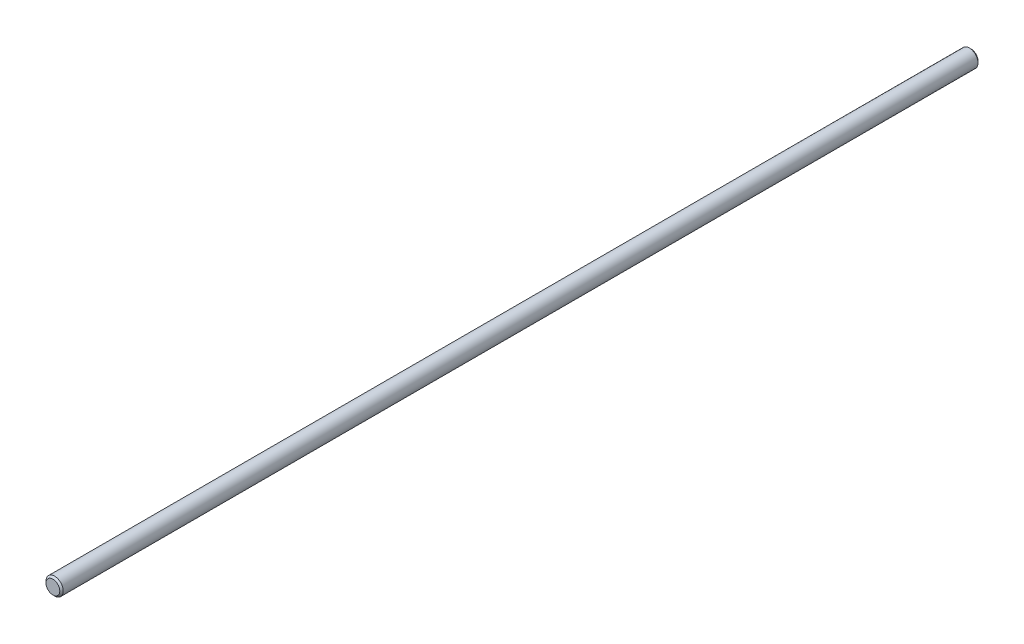
ISO-10303-21;
HEADER;
FILE_DESCRIPTION(('STEP AP214'),'2;1');
FILE_NAME('part.step','',(''),(''),'','','');
FILE_SCHEMA(('AUTOMOTIVE_DESIGN { 1 0 10303 214 1 1 1 1 }'));
ENDSEC;
DATA;
#1=APPLICATION_CONTEXT('core data for automotive mechanical design processes');
#2=APPLICATION_PROTOCOL_DEFINITION('international standard','automotive_design',2000,#1);
#3=PRODUCT_CONTEXT('',#1,'mechanical');
#4=PRODUCT('Part','Part','',(#3));
#5=PRODUCT_RELATED_PRODUCT_CATEGORY('part','',(#4));
#6=PRODUCT_DEFINITION_FORMATION('','',#4);
#7=PRODUCT_DEFINITION_CONTEXT('part definition',#1,'design');
#8=PRODUCT_DEFINITION('design','',#6,#7);
#9=PRODUCT_DEFINITION_SHAPE('','',#8);
#10=(LENGTH_UNIT() NAMED_UNIT(*) SI_UNIT(.MILLI.,.METRE.));
#11=(NAMED_UNIT(*) PLANE_ANGLE_UNIT() SI_UNIT($,.RADIAN.));
#12=(NAMED_UNIT(*) SI_UNIT($,.STERADIAN.) SOLID_ANGLE_UNIT());
#13=UNCERTAINTY_MEASURE_WITH_UNIT(LENGTH_MEASURE(1.E-05),#10,'distance_accuracy_value','');
#14=(GEOMETRIC_REPRESENTATION_CONTEXT(3) GLOBAL_UNCERTAINTY_ASSIGNED_CONTEXT((#13)) GLOBAL_UNIT_ASSIGNED_CONTEXT((#10,
#11,#12)) REPRESENTATION_CONTEXT('',''));
#15=CARTESIAN_POINT('',(0.,0.,0.));
#16=DIRECTION('',(0.,0.,1.));
#17=DIRECTION('',(1.,0.,0.));
#18=AXIS2_PLACEMENT_3D('',#15,#16,#17);
#19=CARTESIAN_POINT('',(0.,0.,160.));
#20=DIRECTION('',(0.,0.,-1.));
#21=DIRECTION('',(-1.,0.,0.));
#22=AXIS2_PLACEMENT_3D('',#19,#20,#21);
#23=CYLINDRICAL_SURFACE('',#22,3.);
#24=CARTESIAN_POINT('',(0.,0.,-159.4));
#25=DIRECTION('',(0.,0.,1.));
#26=DIRECTION('',(1.,0.,0.));
#27=AXIS2_PLACEMENT_3D('',#24,#25,#26);
#28=CIRCLE('',#27,3.);
#29=CARTESIAN_POINT('',(3.,0.,-159.4));
#30=VERTEX_POINT('',#29);
#31=EDGE_CURVE('E42',#30,#30,#28,.T.);
#32=ORIENTED_EDGE('',*,*,#31,.T.);
#33=EDGE_LOOP('',(#32));
#34=FACE_BOUND('',#33,.T.);
#35=CARTESIAN_POINT('',(0.,0.,159.4));
#36=DIRECTION('',(0.,0.,1.));
#37=DIRECTION('',(1.,0.,0.));
#38=AXIS2_PLACEMENT_3D('',#35,#36,#37);
#39=CIRCLE('',#38,3.);
#40=CARTESIAN_POINT('',(3.,0.,159.4));
#41=VERTEX_POINT('',#40);
#42=EDGE_CURVE('E46',#41,#41,#39,.F.);
#43=ORIENTED_EDGE('',*,*,#42,.T.);
#44=EDGE_LOOP('',(#43));
#45=FACE_BOUND('',#44,.T.);
#46=ADVANCED_FACE('F31',(#34,#45),#23,.T.);
#47=CARTESIAN_POINT('',(0.,0.,160.));
#48=DIRECTION('',(0.,0.,1.));
#49=DIRECTION('',(1.,0.,0.));
#50=AXIS2_PLACEMENT_3D('',#47,#48,#49);
#51=PLANE('',#50);
#52=CARTESIAN_POINT('',(0.,0.,160.));
#53=DIRECTION('',(0.,0.,1.));
#54=DIRECTION('',(1.,0.,0.));
#55=AXIS2_PLACEMENT_3D('',#52,#53,#54);
#56=CIRCLE('',#55,2.40000000000004);
#57=CARTESIAN_POINT('',(2.40000000000004,0.,160.));
#58=VERTEX_POINT('',#57);
#59=EDGE_CURVE('E10',#58,#58,#56,.T.);
#60=ORIENTED_EDGE('',*,*,#59,.T.);
#61=EDGE_LOOP('',(#60));
#62=FACE_BOUND('',#61,.T.);
#63=ADVANCED_FACE('F62',(#62),#51,.T.);
#64=CARTESIAN_POINT('',(0.,0.,-160.));
#65=DIRECTION('',(0.,0.,1.));
#66=DIRECTION('',(1.,0.,0.));
#67=AXIS2_PLACEMENT_3D('',#64,#65,#66);
#68=PLANE('',#67);
#69=CARTESIAN_POINT('',(0.,0.,-160.));
#70=DIRECTION('',(0.,0.,1.));
#71=DIRECTION('',(1.,0.,0.));
#72=AXIS2_PLACEMENT_3D('',#69,#70,#71);
#73=CIRCLE('',#72,2.4000000000001);
#74=CARTESIAN_POINT('',(2.4000000000001,0.,-160.));
#75=VERTEX_POINT('',#74);
#76=EDGE_CURVE('E38',#75,#75,#73,.F.);
#77=ORIENTED_EDGE('',*,*,#76,.T.);
#78=EDGE_LOOP('',(#77));
#79=FACE_BOUND('',#78,.T.);
#80=ADVANCED_FACE('F59',(#79),#68,.F.);
#81=CARTESIAN_POINT('',(0.,0.,-159.4));
#82=DIRECTION('',(0.,0.,1.));
#83=DIRECTION('',(1.,0.,0.));
#84=AXIS2_PLACEMENT_3D('',#81,#82,#83);
#85=CONICAL_SURFACE('',#84,3.,0.78539816339747);
#86=ORIENTED_EDGE('',*,*,#76,.F.);
#87=EDGE_LOOP('',(#86));
#88=FACE_BOUND('',#87,.T.);
#89=ORIENTED_EDGE('',*,*,#31,.F.);
#90=EDGE_LOOP('',(#89));
#91=FACE_BOUND('',#90,.T.);
#92=ADVANCED_FACE('F55',(#88,#91),#85,.T.);
#93=CARTESIAN_POINT('',(0.,0.,160.));
#94=DIRECTION('',(0.,0.,-1.));
#95=DIRECTION('',(-1.,0.,0.));
#96=AXIS2_PLACEMENT_3D('',#93,#94,#95);
#97=CONICAL_SURFACE('',#96,2.40000000000004,0.785398163397423);
#98=ORIENTED_EDGE('',*,*,#42,.F.);
#99=EDGE_LOOP('',(#98));
#100=FACE_BOUND('',#99,.T.);
#101=ORIENTED_EDGE('',*,*,#59,.F.);
#102=EDGE_LOOP('',(#101));
#103=FACE_BOUND('',#102,.T.);
#104=ADVANCED_FACE('F33',(#100,#103),#97,.T.);
#105=CLOSED_SHELL('',(#46,#63,#80,#92,#104));
#106=MANIFOLD_SOLID_BREP('B2',#105);
#107=ADVANCED_BREP_SHAPE_REPRESENTATION('',(#18,#106),#14);
#108=SHAPE_DEFINITION_REPRESENTATION(#9,#107);
ENDSEC;
END-ISO-10303-21;
